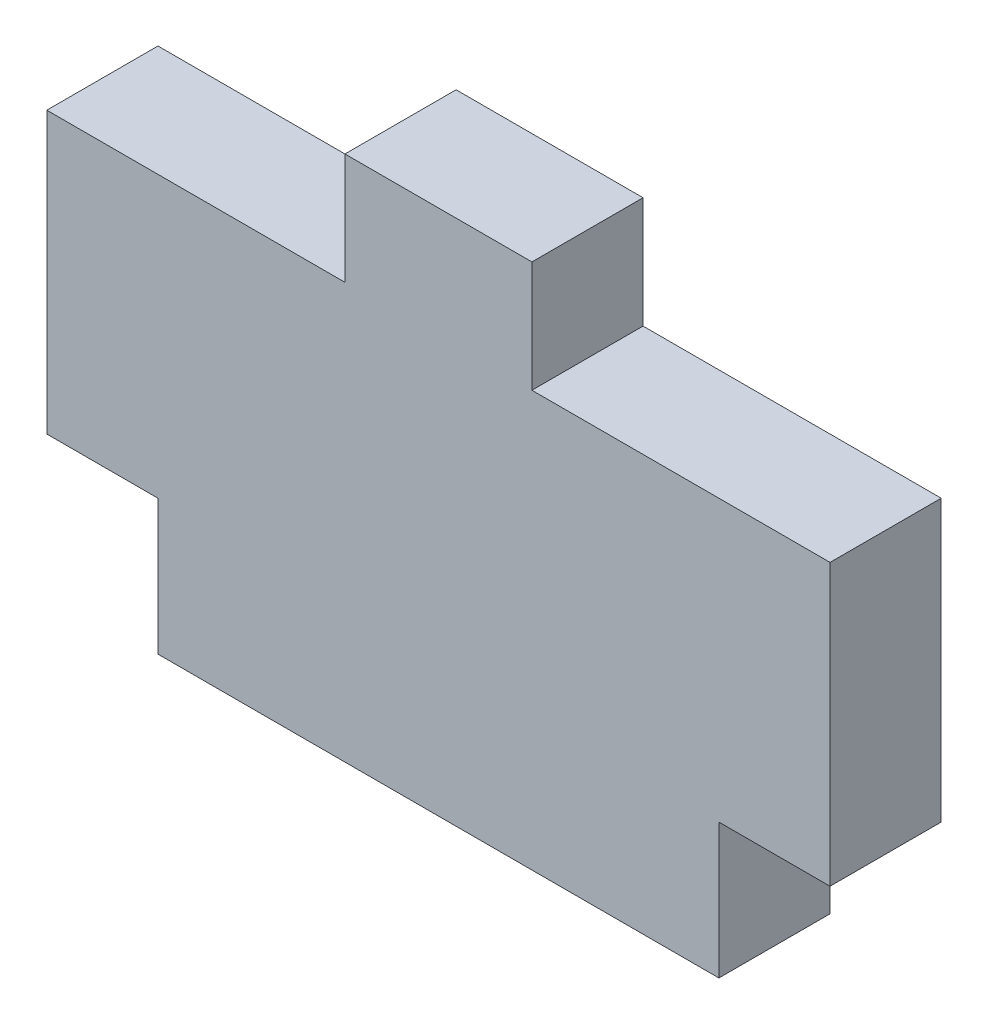
ISO-10303-21;
HEADER;
FILE_DESCRIPTION(('STEP AP214'),'2;1');
FILE_NAME('part.step','',(''),(''),'','','');
FILE_SCHEMA(('AUTOMOTIVE_DESIGN { 1 0 10303 214 1 1 1 1 }'));
ENDSEC;
DATA;
#1=APPLICATION_CONTEXT('core data for automotive mechanical design processes');
#2=APPLICATION_PROTOCOL_DEFINITION('international standard','automotive_design',2000,#1);
#3=PRODUCT_CONTEXT('',#1,'mechanical');
#4=PRODUCT('Part','Part','',(#3));
#5=PRODUCT_RELATED_PRODUCT_CATEGORY('part','',(#4));
#6=PRODUCT_DEFINITION_FORMATION('','',#4);
#7=PRODUCT_DEFINITION_CONTEXT('part definition',#1,'design');
#8=PRODUCT_DEFINITION('design','',#6,#7);
#9=PRODUCT_DEFINITION_SHAPE('','',#8);
#10=(LENGTH_UNIT() NAMED_UNIT(*) SI_UNIT(.MILLI.,.METRE.));
#11=(NAMED_UNIT(*) PLANE_ANGLE_UNIT() SI_UNIT($,.RADIAN.));
#12=(NAMED_UNIT(*) SI_UNIT($,.STERADIAN.) SOLID_ANGLE_UNIT());
#13=UNCERTAINTY_MEASURE_WITH_UNIT(LENGTH_MEASURE(1.E-05),#10,'distance_accuracy_value','');
#14=(GEOMETRIC_REPRESENTATION_CONTEXT(3) GLOBAL_UNCERTAINTY_ASSIGNED_CONTEXT((#13)) GLOBAL_UNIT_ASSIGNED_CONTEXT((#10,
#11,#12)) REPRESENTATION_CONTEXT('',''));
#15=CARTESIAN_POINT('',(0.,0.,0.));
#16=DIRECTION('',(0.,0.,1.));
#17=DIRECTION('',(1.,0.,0.));
#18=AXIS2_PLACEMENT_3D('',#15,#16,#17);
#19=CARTESIAN_POINT('',(18.85,6.5,5.35));
#20=DIRECTION('',(-1.,0.,0.));
#21=DIRECTION('',(0.,0.,1.));
#22=AXIS2_PLACEMENT_3D('',#19,#20,#21);
#23=PLANE('',#22);
#24=DIRECTION('',(0.,1.,0.));
#25=VECTOR('',#24,1.);
#26=CARTESIAN_POINT('',(18.85,6.5,0.));
#27=LINE('',#26,#25);
#28=CARTESIAN_POINT('',(18.85,6.5,0.));
#29=VERTEX_POINT('',#28);
#30=CARTESIAN_POINT('',(18.85,20.,0.));
#31=VERTEX_POINT('',#30);
#32=EDGE_CURVE('E152',#29,#31,#27,.T.);
#33=ORIENTED_EDGE('',*,*,#32,.T.);
#34=DIRECTION('',(0.,0.,-1.));
#35=VECTOR('',#34,1.);
#36=CARTESIAN_POINT('',(18.85,20.,5.35));
#37=LINE('',#36,#35);
#38=CARTESIAN_POINT('',(18.85,20.,5.35));
#39=VERTEX_POINT('',#38);
#40=EDGE_CURVE('E11',#39,#31,#37,.T.);
#41=ORIENTED_EDGE('',*,*,#40,.F.);
#42=DIRECTION('',(0.,1.,0.));
#43=VECTOR('',#42,1.);
#44=CARTESIAN_POINT('',(18.85,6.5,5.35));
#45=LINE('',#44,#43);
#46=CARTESIAN_POINT('',(18.85,6.5,5.35));
#47=VERTEX_POINT('',#46);
#48=EDGE_CURVE('E174',#47,#39,#45,.T.);
#49=ORIENTED_EDGE('',*,*,#48,.F.);
#50=DIRECTION('',(0.,0.,-1.));
#51=VECTOR('',#50,1.);
#52=CARTESIAN_POINT('',(18.85,6.5,5.35));
#53=LINE('',#52,#51);
#54=EDGE_CURVE('E148',#47,#29,#53,.T.);
#55=ORIENTED_EDGE('',*,*,#54,.T.);
#56=EDGE_LOOP('',(#33,#41,#49,#55));
#57=FACE_BOUND('',#56,.T.);
#58=ADVANCED_FACE('F32',(#57),#23,.F.);
#59=CARTESIAN_POINT('',(4.5,20.,5.35));
#60=DIRECTION('',(0.,-1.,0.));
#61=DIRECTION('',(0.,0.,-1.));
#62=AXIS2_PLACEMENT_3D('',#59,#60,#61);
#63=PLANE('',#62);
#64=DIRECTION('',(-1.,0.,0.));
#65=VECTOR('',#64,1.);
#66=CARTESIAN_POINT('',(4.5,20.,0.));
#67=LINE('',#66,#65);
#68=CARTESIAN_POINT('',(4.5,20.,0.));
#69=VERTEX_POINT('',#68);
#70=EDGE_CURVE('E155',#31,#69,#67,.T.);
#71=ORIENTED_EDGE('',*,*,#70,.T.);
#72=DIRECTION('',(0.,0.,-1.));
#73=VECTOR('',#72,1.);
#74=CARTESIAN_POINT('',(4.5,20.,5.35));
#75=LINE('',#74,#73);
#76=CARTESIAN_POINT('',(4.5,20.,5.35));
#77=VERTEX_POINT('',#76);
#78=EDGE_CURVE('E40',#77,#69,#75,.T.);
#79=ORIENTED_EDGE('',*,*,#78,.F.);
#80=DIRECTION('',(-1.,0.,0.));
#81=VECTOR('',#80,1.);
#82=CARTESIAN_POINT('',(4.5,20.,5.35));
#83=LINE('',#82,#81);
#84=EDGE_CURVE('E103',#39,#77,#83,.T.);
#85=ORIENTED_EDGE('',*,*,#84,.F.);
#86=ORIENTED_EDGE('',*,*,#40,.T.);
#87=EDGE_LOOP('',(#71,#79,#85,#86));
#88=FACE_BOUND('',#87,.T.);
#89=ADVANCED_FACE('F252',(#88),#63,.F.);
#90=CARTESIAN_POINT('',(4.5,20.,5.35));
#91=DIRECTION('',(-1.,0.,0.));
#92=DIRECTION('',(0.,-1.,0.));
#93=AXIS2_PLACEMENT_3D('',#90,#91,#92);
#94=PLANE('',#93);
#95=DIRECTION('',(0.,1.,0.));
#96=VECTOR('',#95,1.);
#97=CARTESIAN_POINT('',(4.5,20.,0.));
#98=LINE('',#97,#96);
#99=CARTESIAN_POINT('',(4.5,25.35,0.));
#100=VERTEX_POINT('',#99);
#101=EDGE_CURVE('E157',#69,#100,#98,.T.);
#102=ORIENTED_EDGE('',*,*,#101,.T.);
#103=DIRECTION('',(0.,0.,-1.));
#104=VECTOR('',#103,1.);
#105=CARTESIAN_POINT('',(4.5,25.35,5.35));
#106=LINE('',#105,#104);
#107=CARTESIAN_POINT('',(4.5,25.35,5.35));
#108=VERTEX_POINT('',#107);
#109=EDGE_CURVE('E193',#108,#100,#106,.T.);
#110=ORIENTED_EDGE('',*,*,#109,.F.);
#111=DIRECTION('',(0.,1.,0.));
#112=VECTOR('',#111,1.);
#113=CARTESIAN_POINT('',(4.5,20.,5.35));
#114=LINE('',#113,#112);
#115=EDGE_CURVE('E201',#77,#108,#114,.T.);
#116=ORIENTED_EDGE('',*,*,#115,.F.);
#117=ORIENTED_EDGE('',*,*,#78,.T.);
#118=EDGE_LOOP('',(#102,#110,#116,#117));
#119=FACE_BOUND('',#118,.T.);
#120=ADVANCED_FACE('F199',(#119),#94,.F.);
#121=CARTESIAN_POINT('',(-4.5,25.35,5.35));
#122=DIRECTION('',(0.,-1.,0.));
#123=DIRECTION('',(0.,0.,-1.));
#124=AXIS2_PLACEMENT_3D('',#121,#122,#123);
#125=PLANE('',#124);
#126=DIRECTION('',(-1.,0.,0.));
#127=VECTOR('',#126,1.);
#128=CARTESIAN_POINT('',(-4.5,25.35,0.));
#129=LINE('',#128,#127);
#130=CARTESIAN_POINT('',(-4.5,25.35,0.));
#131=VERTEX_POINT('',#130);
#132=EDGE_CURVE('E159',#100,#131,#129,.T.);
#133=ORIENTED_EDGE('',*,*,#132,.T.);
#134=DIRECTION('',(0.,0.,-1.));
#135=VECTOR('',#134,1.);
#136=CARTESIAN_POINT('',(-4.5,25.35,5.35));
#137=LINE('',#136,#135);
#138=CARTESIAN_POINT('',(-4.5,25.35,5.35));
#139=VERTEX_POINT('',#138);
#140=EDGE_CURVE('E190',#139,#131,#137,.T.);
#141=ORIENTED_EDGE('',*,*,#140,.F.);
#142=DIRECTION('',(-1.,0.,0.));
#143=VECTOR('',#142,1.);
#144=CARTESIAN_POINT('',(-4.5,25.35,5.35));
#145=LINE('',#144,#143);
#146=EDGE_CURVE('E219',#108,#139,#145,.T.);
#147=ORIENTED_EDGE('',*,*,#146,.F.);
#148=ORIENTED_EDGE('',*,*,#109,.T.);
#149=EDGE_LOOP('',(#133,#141,#147,#148));
#150=FACE_BOUND('',#149,.T.);
#151=ADVANCED_FACE('F210',(#150),#125,.F.);
#152=CARTESIAN_POINT('',(-4.5,20.,5.35));
#153=DIRECTION('',(1.,0.,0.));
#154=DIRECTION('',(0.,1.,0.));
#155=AXIS2_PLACEMENT_3D('',#152,#153,#154);
#156=PLANE('',#155);
#157=DIRECTION('',(0.,-1.,0.));
#158=VECTOR('',#157,1.);
#159=CARTESIAN_POINT('',(-4.5,20.,0.));
#160=LINE('',#159,#158);
#161=CARTESIAN_POINT('',(-4.5,20.,0.));
#162=VERTEX_POINT('',#161);
#163=EDGE_CURVE('E161',#131,#162,#160,.T.);
#164=ORIENTED_EDGE('',*,*,#163,.T.);
#165=DIRECTION('',(0.,0.,-1.));
#166=VECTOR('',#165,1.);
#167=CARTESIAN_POINT('',(-4.5,20.,5.35));
#168=LINE('',#167,#166);
#169=CARTESIAN_POINT('',(-4.5,20.,5.35));
#170=VERTEX_POINT('',#169);
#171=EDGE_CURVE('E187',#170,#162,#168,.T.);
#172=ORIENTED_EDGE('',*,*,#171,.F.);
#173=DIRECTION('',(0.,-1.,0.));
#174=VECTOR('',#173,1.);
#175=CARTESIAN_POINT('',(-4.5,20.,5.35));
#176=LINE('',#175,#174);
#177=EDGE_CURVE('E216',#139,#170,#176,.T.);
#178=ORIENTED_EDGE('',*,*,#177,.F.);
#179=ORIENTED_EDGE('',*,*,#140,.T.);
#180=EDGE_LOOP('',(#164,#172,#178,#179));
#181=FACE_BOUND('',#180,.T.);
#182=ADVANCED_FACE('F214',(#181),#156,.F.);
#183=CARTESIAN_POINT('',(-18.85,20.,5.35));
#184=DIRECTION('',(0.,-1.,0.));
#185=DIRECTION('',(0.,0.,-1.));
#186=AXIS2_PLACEMENT_3D('',#183,#184,#185);
#187=PLANE('',#186);
#188=DIRECTION('',(-1.,0.,0.));
#189=VECTOR('',#188,1.);
#190=CARTESIAN_POINT('',(-18.85,20.,0.));
#191=LINE('',#190,#189);
#192=CARTESIAN_POINT('',(-18.85,20.,0.));
#193=VERTEX_POINT('',#192);
#194=EDGE_CURVE('E163',#162,#193,#191,.T.);
#195=ORIENTED_EDGE('',*,*,#194,.T.);
#196=DIRECTION('',(0.,0.,-1.));
#197=VECTOR('',#196,1.);
#198=CARTESIAN_POINT('',(-18.85,20.,5.35));
#199=LINE('',#198,#197);
#200=CARTESIAN_POINT('',(-18.85,20.,5.35));
#201=VERTEX_POINT('',#200);
#202=EDGE_CURVE('E184',#201,#193,#199,.T.);
#203=ORIENTED_EDGE('',*,*,#202,.F.);
#204=DIRECTION('',(-1.,0.,0.));
#205=VECTOR('',#204,1.);
#206=CARTESIAN_POINT('',(-18.85,20.,5.35));
#207=LINE('',#206,#205);
#208=EDGE_CURVE('E218',#170,#201,#207,.T.);
#209=ORIENTED_EDGE('',*,*,#208,.F.);
#210=ORIENTED_EDGE('',*,*,#171,.T.);
#211=EDGE_LOOP('',(#195,#203,#209,#210));
#212=FACE_BOUND('',#211,.T.);
#213=ADVANCED_FACE('F265',(#212),#187,.F.);
#214=CARTESIAN_POINT('',(-18.85,6.5,5.35));
#215=DIRECTION('',(1.,0.,0.));
#216=DIRECTION('',(0.,0.,-1.));
#217=AXIS2_PLACEMENT_3D('',#214,#215,#216);
#218=PLANE('',#217);
#219=DIRECTION('',(0.,-1.,0.));
#220=VECTOR('',#219,1.);
#221=CARTESIAN_POINT('',(-18.85,6.5,0.));
#222=LINE('',#221,#220);
#223=CARTESIAN_POINT('',(-18.85,6.5,0.));
#224=VERTEX_POINT('',#223);
#225=EDGE_CURVE('E165',#193,#224,#222,.T.);
#226=ORIENTED_EDGE('',*,*,#225,.T.);
#227=DIRECTION('',(0.,0.,-1.));
#228=VECTOR('',#227,1.);
#229=CARTESIAN_POINT('',(-18.85,6.5,5.35));
#230=LINE('',#229,#228);
#231=CARTESIAN_POINT('',(-18.85,6.5,5.35));
#232=VERTEX_POINT('',#231);
#233=EDGE_CURVE('E181',#232,#224,#230,.T.);
#234=ORIENTED_EDGE('',*,*,#233,.F.);
#235=DIRECTION('',(0.,-1.,0.));
#236=VECTOR('',#235,1.);
#237=CARTESIAN_POINT('',(-18.85,6.5,5.35));
#238=LINE('',#237,#236);
#239=EDGE_CURVE('E221',#201,#232,#238,.T.);
#240=ORIENTED_EDGE('',*,*,#239,.F.);
#241=ORIENTED_EDGE('',*,*,#202,.T.);
#242=EDGE_LOOP('',(#226,#234,#240,#241));
#243=FACE_BOUND('',#242,.T.);
#244=ADVANCED_FACE('F268',(#243),#218,.F.);
#245=CARTESIAN_POINT('',(-18.85,6.5,5.35));
#246=DIRECTION('',(0.,1.,0.));
#247=DIRECTION('',(0.,0.,1.));
#248=AXIS2_PLACEMENT_3D('',#245,#246,#247);
#249=PLANE('',#248);
#250=DIRECTION('',(1.,0.,0.));
#251=VECTOR('',#250,1.);
#252=CARTESIAN_POINT('',(-18.85,6.5,0.));
#253=LINE('',#252,#251);
#254=CARTESIAN_POINT('',(-13.5,6.5,0.));
#255=VERTEX_POINT('',#254);
#256=EDGE_CURVE('E167',#224,#255,#253,.T.);
#257=ORIENTED_EDGE('',*,*,#256,.T.);
#258=DIRECTION('',(0.,0.,-1.));
#259=VECTOR('',#258,1.);
#260=CARTESIAN_POINT('',(-13.5,6.5,5.35));
#261=LINE('',#260,#259);
#262=CARTESIAN_POINT('',(-13.5,6.5,5.35));
#263=VERTEX_POINT('',#262);
#264=EDGE_CURVE('E178',#263,#255,#261,.T.);
#265=ORIENTED_EDGE('',*,*,#264,.F.);
#266=DIRECTION('',(1.,0.,0.));
#267=VECTOR('',#266,1.);
#268=CARTESIAN_POINT('',(-18.85,6.5,5.35));
#269=LINE('',#268,#267);
#270=EDGE_CURVE('E227',#232,#263,#269,.T.);
#271=ORIENTED_EDGE('',*,*,#270,.F.);
#272=ORIENTED_EDGE('',*,*,#233,.T.);
#273=EDGE_LOOP('',(#257,#265,#271,#272));
#274=FACE_BOUND('',#273,.T.);
#275=ADVANCED_FACE('F233',(#274),#249,.F.);
#276=CARTESIAN_POINT('',(-13.5,6.5,5.35));
#277=DIRECTION('',(1.,0.,0.));
#278=DIRECTION('',(0.,0.,-1.));
#279=AXIS2_PLACEMENT_3D('',#276,#277,#278);
#280=PLANE('',#279);
#281=DIRECTION('',(0.,-1.,0.));
#282=VECTOR('',#281,1.);
#283=CARTESIAN_POINT('',(-13.5,6.5,0.));
#284=LINE('',#283,#282);
#285=CARTESIAN_POINT('',(-13.5,0.,0.));
#286=VERTEX_POINT('',#285);
#287=EDGE_CURVE('E169',#255,#286,#284,.T.);
#288=ORIENTED_EDGE('',*,*,#287,.T.);
#289=DIRECTION('',(0.,0.,-1.));
#290=VECTOR('',#289,1.);
#291=CARTESIAN_POINT('',(-13.5,0.,5.35));
#292=LINE('',#291,#290);
#293=CARTESIAN_POINT('',(-13.5,0.,5.35));
#294=VERTEX_POINT('',#293);
#295=EDGE_CURVE('E143',#294,#286,#292,.T.);
#296=ORIENTED_EDGE('',*,*,#295,.F.);
#297=DIRECTION('',(0.,-1.,0.));
#298=VECTOR('',#297,1.);
#299=CARTESIAN_POINT('',(-13.5,6.5,5.35));
#300=LINE('',#299,#298);
#301=EDGE_CURVE('E134',#263,#294,#300,.T.);
#302=ORIENTED_EDGE('',*,*,#301,.F.);
#303=ORIENTED_EDGE('',*,*,#264,.T.);
#304=EDGE_LOOP('',(#288,#296,#302,#303));
#305=FACE_BOUND('',#304,.T.);
#306=ADVANCED_FACE('F237',(#305),#280,.F.);
#307=CARTESIAN_POINT('',(-13.5,0.,5.35));
#308=DIRECTION('',(0.,1.,0.));
#309=DIRECTION('',(0.,0.,1.));
#310=AXIS2_PLACEMENT_3D('',#307,#308,#309);
#311=PLANE('',#310);
#312=DIRECTION('',(1.,0.,0.));
#313=VECTOR('',#312,1.);
#314=CARTESIAN_POINT('',(-13.5,0.,0.));
#315=LINE('',#314,#313);
#316=CARTESIAN_POINT('',(13.5,0.,0.));
#317=VERTEX_POINT('',#316);
#318=EDGE_CURVE('E142',#286,#317,#315,.T.);
#319=ORIENTED_EDGE('',*,*,#318,.T.);
#320=DIRECTION('',(0.,0.,-1.));
#321=VECTOR('',#320,1.);
#322=CARTESIAN_POINT('',(13.5,0.,5.35));
#323=LINE('',#322,#321);
#324=CARTESIAN_POINT('',(13.5,0.,5.35));
#325=VERTEX_POINT('',#324);
#326=EDGE_CURVE('E139',#325,#317,#323,.T.);
#327=ORIENTED_EDGE('',*,*,#326,.F.);
#328=DIRECTION('',(1.,0.,0.));
#329=VECTOR('',#328,1.);
#330=CARTESIAN_POINT('',(-13.5,0.,5.35));
#331=LINE('',#330,#329);
#332=EDGE_CURVE('E128',#294,#325,#331,.T.);
#333=ORIENTED_EDGE('',*,*,#332,.F.);
#334=ORIENTED_EDGE('',*,*,#295,.T.);
#335=EDGE_LOOP('',(#319,#327,#333,#334));
#336=FACE_BOUND('',#335,.T.);
#337=ADVANCED_FACE('F140',(#336),#311,.F.);
#338=CARTESIAN_POINT('',(13.5,6.5,5.35));
#339=DIRECTION('',(-1.,0.,0.));
#340=DIRECTION('',(0.,0.,1.));
#341=AXIS2_PLACEMENT_3D('',#338,#339,#340);
#342=PLANE('',#341);
#343=DIRECTION('',(0.,1.,0.));
#344=VECTOR('',#343,1.);
#345=CARTESIAN_POINT('',(13.5,6.5,0.));
#346=LINE('',#345,#344);
#347=CARTESIAN_POINT('',(13.5,6.5,0.));
#348=VERTEX_POINT('',#347);
#349=EDGE_CURVE('E89',#317,#348,#346,.T.);
#350=ORIENTED_EDGE('',*,*,#349,.T.);
#351=DIRECTION('',(0.,0.,-1.));
#352=VECTOR('',#351,1.);
#353=CARTESIAN_POINT('',(13.5,6.5,5.35));
#354=LINE('',#353,#352);
#355=CARTESIAN_POINT('',(13.5,6.5,5.35));
#356=VERTEX_POINT('',#355);
#357=EDGE_CURVE('E144',#356,#348,#354,.T.);
#358=ORIENTED_EDGE('',*,*,#357,.F.);
#359=DIRECTION('',(0.,1.,0.));
#360=VECTOR('',#359,1.);
#361=CARTESIAN_POINT('',(13.5,6.5,5.35));
#362=LINE('',#361,#360);
#363=EDGE_CURVE('E132',#325,#356,#362,.T.);
#364=ORIENTED_EDGE('',*,*,#363,.F.);
#365=ORIENTED_EDGE('',*,*,#326,.T.);
#366=EDGE_LOOP('',(#350,#358,#364,#365));
#367=FACE_BOUND('',#366,.T.);
#368=ADVANCED_FACE('F146',(#367),#342,.F.);
#369=CARTESIAN_POINT('',(18.85,6.5,5.35));
#370=DIRECTION('',(0.,1.,0.));
#371=DIRECTION('',(0.,0.,1.));
#372=AXIS2_PLACEMENT_3D('',#369,#370,#371);
#373=PLANE('',#372);
#374=DIRECTION('',(1.,0.,0.));
#375=VECTOR('',#374,1.);
#376=CARTESIAN_POINT('',(18.85,6.5,0.));
#377=LINE('',#376,#375);
#378=EDGE_CURVE('E95',#348,#29,#377,.T.);
#379=ORIENTED_EDGE('',*,*,#378,.T.);
#380=ORIENTED_EDGE('',*,*,#54,.F.);
#381=DIRECTION('',(1.,0.,0.));
#382=VECTOR('',#381,1.);
#383=CARTESIAN_POINT('',(18.85,6.5,5.35));
#384=LINE('',#383,#382);
#385=EDGE_CURVE('E48',#356,#47,#384,.T.);
#386=ORIENTED_EDGE('',*,*,#385,.F.);
#387=ORIENTED_EDGE('',*,*,#357,.T.);
#388=EDGE_LOOP('',(#379,#380,#386,#387));
#389=FACE_BOUND('',#388,.T.);
#390=ADVANCED_FACE('F241',(#389),#373,.F.);
#391=CARTESIAN_POINT('',(0.,0.,5.35));
#392=DIRECTION('',(0.,0.,-1.));
#393=DIRECTION('',(-1.,0.,0.));
#394=AXIS2_PLACEMENT_3D('',#391,#392,#393);
#395=PLANE('',#394);
#396=ORIENTED_EDGE('',*,*,#48,.T.);
#397=ORIENTED_EDGE('',*,*,#84,.T.);
#398=ORIENTED_EDGE('',*,*,#115,.T.);
#399=ORIENTED_EDGE('',*,*,#146,.T.);
#400=ORIENTED_EDGE('',*,*,#177,.T.);
#401=ORIENTED_EDGE('',*,*,#208,.T.);
#402=ORIENTED_EDGE('',*,*,#239,.T.);
#403=ORIENTED_EDGE('',*,*,#270,.T.);
#404=ORIENTED_EDGE('',*,*,#301,.T.);
#405=ORIENTED_EDGE('',*,*,#332,.T.);
#406=ORIENTED_EDGE('',*,*,#363,.T.);
#407=ORIENTED_EDGE('',*,*,#385,.T.);
#408=EDGE_LOOP('',(#396,#397,#398,#399,#400,#401,#402,#403,#404,#405,#406,#407));
#409=FACE_BOUND('',#408,.T.);
#410=ADVANCED_FACE('F130',(#409),#395,.F.);
#411=CARTESIAN_POINT('',(0.,0.,0.));
#412=DIRECTION('',(0.,0.,-1.));
#413=DIRECTION('',(-1.,0.,0.));
#414=AXIS2_PLACEMENT_3D('',#411,#412,#413);
#415=PLANE('',#414);
#416=ORIENTED_EDGE('',*,*,#32,.F.);
#417=ORIENTED_EDGE('',*,*,#378,.F.);
#418=ORIENTED_EDGE('',*,*,#349,.F.);
#419=ORIENTED_EDGE('',*,*,#318,.F.);
#420=ORIENTED_EDGE('',*,*,#287,.F.);
#421=ORIENTED_EDGE('',*,*,#256,.F.);
#422=ORIENTED_EDGE('',*,*,#225,.F.);
#423=ORIENTED_EDGE('',*,*,#194,.F.);
#424=ORIENTED_EDGE('',*,*,#163,.F.);
#425=ORIENTED_EDGE('',*,*,#132,.F.);
#426=ORIENTED_EDGE('',*,*,#101,.F.);
#427=ORIENTED_EDGE('',*,*,#70,.F.);
#428=EDGE_LOOP('',(#416,#417,#418,#419,#420,#421,#422,#423,#424,#425,#426,#427));
#429=FACE_BOUND('',#428,.T.);
#430=ADVANCED_FACE('F205',(#429),#415,.T.);
#431=CLOSED_SHELL('',(#58,#89,#120,#151,#182,#213,#244,#275,#306,#337,#368,#390,#410,#430));
#432=MANIFOLD_SOLID_BREP('B2',#431);
#433=ADVANCED_BREP_SHAPE_REPRESENTATION('',(#18,#432),#14);
#434=SHAPE_DEFINITION_REPRESENTATION(#9,#433);
ENDSEC;
END-ISO-10303-21;
